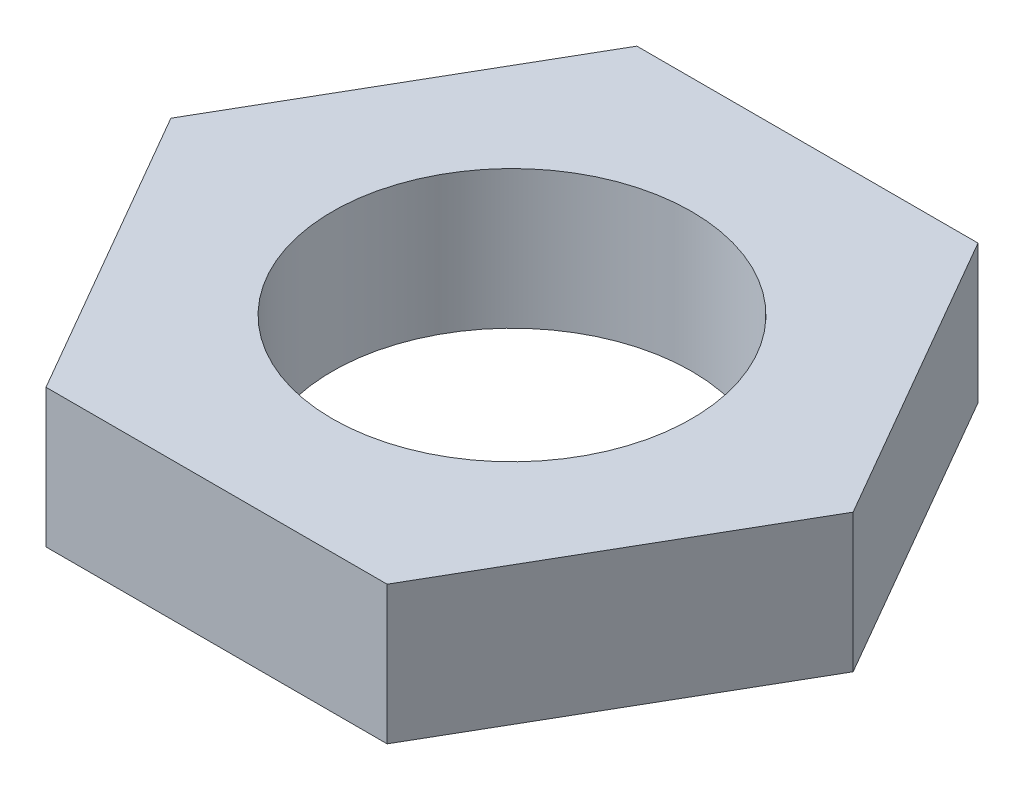
ISO-10303-21;
HEADER;
FILE_DESCRIPTION(('STEP AP214'),'2;1');
FILE_NAME('part.step','',(''),(''),'','','');
FILE_SCHEMA(('AUTOMOTIVE_DESIGN { 1 0 10303 214 1 1 1 1 }'));
ENDSEC;
DATA;
#1=APPLICATION_CONTEXT('core data for automotive mechanical design processes');
#2=APPLICATION_PROTOCOL_DEFINITION('international standard','automotive_design',2000,#1);
#3=PRODUCT_CONTEXT('',#1,'mechanical');
#4=PRODUCT('Part','Part','',(#3));
#5=PRODUCT_RELATED_PRODUCT_CATEGORY('part','',(#4));
#6=PRODUCT_DEFINITION_FORMATION('','',#4);
#7=PRODUCT_DEFINITION_CONTEXT('part definition',#1,'design');
#8=PRODUCT_DEFINITION('design','',#6,#7);
#9=PRODUCT_DEFINITION_SHAPE('','',#8);
#10=(LENGTH_UNIT() NAMED_UNIT(*) SI_UNIT(.MILLI.,.METRE.));
#11=(NAMED_UNIT(*) PLANE_ANGLE_UNIT() SI_UNIT($,.RADIAN.));
#12=(NAMED_UNIT(*) SI_UNIT($,.STERADIAN.) SOLID_ANGLE_UNIT());
#13=UNCERTAINTY_MEASURE_WITH_UNIT(LENGTH_MEASURE(1.E-05),#10,'distance_accuracy_value','');
#14=(GEOMETRIC_REPRESENTATION_CONTEXT(3) GLOBAL_UNCERTAINTY_ASSIGNED_CONTEXT((#13)) GLOBAL_UNIT_ASSIGNED_CONTEXT((#10,
#11,#12)) REPRESENTATION_CONTEXT('',''));
#15=CARTESIAN_POINT('',(0.,0.,0.));
#16=DIRECTION('',(0.,0.,1.));
#17=DIRECTION('',(1.,0.,0.));
#18=AXIS2_PLACEMENT_3D('',#15,#16,#17);
#19=CARTESIAN_POINT('',(0.,2.31,0.));
#20=DIRECTION('',(0.,1.,0.));
#21=DIRECTION('',(0.,0.,1.));
#22=AXIS2_PLACEMENT_3D('',#19,#20,#21);
#23=PLANE('',#22);
#24=DIRECTION('',(0.5,0.,0.866025403784439));
#25=VECTOR('',#24,1.);
#26=CARTESIAN_POINT('',(-5.6984471569016,2.31,0.));
#27=LINE('',#26,#25);
#28=CARTESIAN_POINT('',(-5.6984471569016,2.31,0.));
#29=VERTEX_POINT('',#28);
#30=CARTESIAN_POINT('',(-2.8492235784508,2.31,4.935));
#31=VERTEX_POINT('',#30);
#32=EDGE_CURVE('E135',#29,#31,#27,.T.);
#33=ORIENTED_EDGE('',*,*,#32,.T.);
#34=DIRECTION('',(1.,0.,0.));
#35=VECTOR('',#34,1.);
#36=CARTESIAN_POINT('',(-2.8492235784508,2.31,4.935));
#37=LINE('',#36,#35);
#38=CARTESIAN_POINT('',(2.8492235784508,2.31,4.935));
#39=VERTEX_POINT('',#38);
#40=EDGE_CURVE('E93',#31,#39,#37,.T.);
#41=ORIENTED_EDGE('',*,*,#40,.T.);
#42=DIRECTION('',(0.5,0.,-0.866025403784439));
#43=VECTOR('',#42,1.);
#44=CARTESIAN_POINT('',(2.8492235784508,2.31,4.935));
#45=LINE('',#44,#43);
#46=CARTESIAN_POINT('',(5.6984471569016,2.31,0.));
#47=VERTEX_POINT('',#46);
#48=EDGE_CURVE('E106',#39,#47,#45,.T.);
#49=ORIENTED_EDGE('',*,*,#48,.T.);
#50=DIRECTION('',(-0.5,0.,-0.866025403784438));
#51=VECTOR('',#50,1.);
#52=CARTESIAN_POINT('',(5.6984471569016,2.31,0.));
#53=LINE('',#52,#51);
#54=CARTESIAN_POINT('',(2.8492235784508,2.31,-4.935));
#55=VERTEX_POINT('',#54);
#56=EDGE_CURVE('E100',#47,#55,#53,.T.);
#57=ORIENTED_EDGE('',*,*,#56,.T.);
#58=DIRECTION('',(-1.,0.,0.));
#59=VECTOR('',#58,1.);
#60=CARTESIAN_POINT('',(2.8492235784508,2.31,-4.935));
#61=LINE('',#60,#59);
#62=CARTESIAN_POINT('',(-2.8492235784508,2.31,-4.935));
#63=VERTEX_POINT('',#62);
#64=EDGE_CURVE('E104',#55,#63,#61,.T.);
#65=ORIENTED_EDGE('',*,*,#64,.T.);
#66=DIRECTION('',(-0.5,0.,0.866025403784439));
#67=VECTOR('',#66,1.);
#68=CARTESIAN_POINT('',(-2.8492235784508,2.31,-4.935));
#69=LINE('',#68,#67);
#70=EDGE_CURVE('E56',#63,#29,#69,.T.);
#71=ORIENTED_EDGE('',*,*,#70,.T.);
#72=EDGE_LOOP('',(#33,#41,#49,#57,#65,#71));
#73=FACE_BOUND('',#72,.T.);
#74=CARTESIAN_POINT('',(0.,2.31,0.));
#75=DIRECTION('',(0.,1.,0.));
#76=DIRECTION('',(0.,0.,1.));
#77=AXIS2_PLACEMENT_3D('',#74,#75,#76);
#78=CIRCLE('',#77,3.);
#79=CARTESIAN_POINT('',(0.,2.31,3.));
#80=VERTEX_POINT('',#79);
#81=EDGE_CURVE('E128',#80,#80,#78,.T.);
#82=ORIENTED_EDGE('',*,*,#81,.F.);
#83=EDGE_LOOP('',(#82));
#84=FACE_BOUND('',#83,.T.);
#85=ADVANCED_FACE('F39',(#73,#84),#23,.T.);
#86=CARTESIAN_POINT('',(0.,0.,0.));
#87=DIRECTION('',(0.,1.,0.));
#88=DIRECTION('',(0.,0.,1.));
#89=AXIS2_PLACEMENT_3D('',#86,#87,#88);
#90=PLANE('',#89);
#91=DIRECTION('',(0.5,0.,0.866025403784439));
#92=VECTOR('',#91,1.);
#93=CARTESIAN_POINT('',(-5.6984471569016,0.,0.));
#94=LINE('',#93,#92);
#95=CARTESIAN_POINT('',(-5.6984471569016,0.,0.));
#96=VERTEX_POINT('',#95);
#97=CARTESIAN_POINT('',(-2.8492235784508,0.,4.935));
#98=VERTEX_POINT('',#97);
#99=EDGE_CURVE('E124',#96,#98,#94,.T.);
#100=ORIENTED_EDGE('',*,*,#99,.F.);
#101=DIRECTION('',(-0.5,0.,0.866025403784439));
#102=VECTOR('',#101,1.);
#103=CARTESIAN_POINT('',(-2.8492235784508,0.,-4.935));
#104=LINE('',#103,#102);
#105=CARTESIAN_POINT('',(-2.8492235784508,0.,-4.935));
#106=VERTEX_POINT('',#105);
#107=EDGE_CURVE('E85',#106,#96,#104,.T.);
#108=ORIENTED_EDGE('',*,*,#107,.F.);
#109=DIRECTION('',(-1.,0.,0.));
#110=VECTOR('',#109,1.);
#111=CARTESIAN_POINT('',(2.8492235784508,0.,-4.935));
#112=LINE('',#111,#110);
#113=CARTESIAN_POINT('',(2.8492235784508,0.,-4.935));
#114=VERTEX_POINT('',#113);
#115=EDGE_CURVE('E79',#114,#106,#112,.T.);
#116=ORIENTED_EDGE('',*,*,#115,.F.);
#117=DIRECTION('',(-0.5,0.,-0.866025403784438));
#118=VECTOR('',#117,1.);
#119=CARTESIAN_POINT('',(5.6984471569016,0.,0.));
#120=LINE('',#119,#118);
#121=CARTESIAN_POINT('',(5.6984471569016,0.,0.));
#122=VERTEX_POINT('',#121);
#123=EDGE_CURVE('E114',#122,#114,#120,.T.);
#124=ORIENTED_EDGE('',*,*,#123,.F.);
#125=DIRECTION('',(0.5,0.,-0.866025403784439));
#126=VECTOR('',#125,1.);
#127=CARTESIAN_POINT('',(2.8492235784508,0.,4.935));
#128=LINE('',#127,#126);
#129=CARTESIAN_POINT('',(2.8492235784508,0.,4.935));
#130=VERTEX_POINT('',#129);
#131=EDGE_CURVE('E130',#130,#122,#128,.T.);
#132=ORIENTED_EDGE('',*,*,#131,.F.);
#133=DIRECTION('',(1.,0.,0.));
#134=VECTOR('',#133,1.);
#135=CARTESIAN_POINT('',(-2.8492235784508,0.,4.935));
#136=LINE('',#135,#134);
#137=EDGE_CURVE('E127',#98,#130,#136,.T.);
#138=ORIENTED_EDGE('',*,*,#137,.F.);
#139=EDGE_LOOP('',(#100,#108,#116,#124,#132,#138));
#140=FACE_BOUND('',#139,.T.);
#141=CARTESIAN_POINT('',(0.,0.,0.));
#142=DIRECTION('',(0.,1.,0.));
#143=DIRECTION('',(0.,0.,1.));
#144=AXIS2_PLACEMENT_3D('',#141,#142,#143);
#145=CIRCLE('',#144,3.);
#146=CARTESIAN_POINT('',(0.,0.,3.));
#147=VERTEX_POINT('',#146);
#148=EDGE_CURVE('E228',#147,#147,#145,.T.);
#149=ORIENTED_EDGE('',*,*,#148,.T.);
#150=EDGE_LOOP('',(#149));
#151=FACE_BOUND('',#150,.T.);
#152=ADVANCED_FACE('F144',(#140,#151),#90,.F.);
#153=CARTESIAN_POINT('',(-5.6984471569016,2.31,0.));
#154=DIRECTION('',(0.866025403784439,0.,-0.5));
#155=DIRECTION('',(-0.5,0.,-0.866025403784439));
#156=AXIS2_PLACEMENT_3D('',#153,#154,#155);
#157=PLANE('',#156);
#158=ORIENTED_EDGE('',*,*,#99,.T.);
#159=DIRECTION('',(0.,-1.,0.));
#160=VECTOR('',#159,1.);
#161=CARTESIAN_POINT('',(-2.8492235784508,2.31,4.935));
#162=LINE('',#161,#160);
#163=EDGE_CURVE('E11',#31,#98,#162,.T.);
#164=ORIENTED_EDGE('',*,*,#163,.F.);
#165=ORIENTED_EDGE('',*,*,#32,.F.);
#166=DIRECTION('',(0.,-1.,0.));
#167=VECTOR('',#166,1.);
#168=CARTESIAN_POINT('',(-5.6984471569016,2.31,0.));
#169=LINE('',#168,#167);
#170=EDGE_CURVE('E120',#29,#96,#169,.T.);
#171=ORIENTED_EDGE('',*,*,#170,.T.);
#172=EDGE_LOOP('',(#158,#164,#165,#171));
#173=FACE_BOUND('',#172,.T.);
#174=ADVANCED_FACE('F41',(#173),#157,.F.);
#175=CARTESIAN_POINT('',(-2.8492235784508,2.31,4.935));
#176=DIRECTION('',(0.,0.,-1.));
#177=DIRECTION('',(-1.,0.,0.));
#178=AXIS2_PLACEMENT_3D('',#175,#176,#177);
#179=PLANE('',#178);
#180=ORIENTED_EDGE('',*,*,#137,.T.);
#181=DIRECTION('',(0.,-1.,0.));
#182=VECTOR('',#181,1.);
#183=CARTESIAN_POINT('',(2.8492235784508,2.31,4.935));
#184=LINE('',#183,#182);
#185=EDGE_CURVE('E48',#39,#130,#184,.T.);
#186=ORIENTED_EDGE('',*,*,#185,.F.);
#187=ORIENTED_EDGE('',*,*,#40,.F.);
#188=ORIENTED_EDGE('',*,*,#163,.T.);
#189=EDGE_LOOP('',(#180,#186,#187,#188));
#190=FACE_BOUND('',#189,.T.);
#191=ADVANCED_FACE('F169',(#190),#179,.F.);
#192=CARTESIAN_POINT('',(2.8492235784508,2.31,4.935));
#193=DIRECTION('',(-0.866025403784439,0.,-0.5));
#194=DIRECTION('',(-0.5,0.,0.866025403784439));
#195=AXIS2_PLACEMENT_3D('',#192,#193,#194);
#196=PLANE('',#195);
#197=ORIENTED_EDGE('',*,*,#131,.T.);
#198=DIRECTION('',(0.,-1.,0.));
#199=VECTOR('',#198,1.);
#200=CARTESIAN_POINT('',(5.6984471569016,2.31,0.));
#201=LINE('',#200,#199);
#202=EDGE_CURVE('E115',#47,#122,#201,.T.);
#203=ORIENTED_EDGE('',*,*,#202,.F.);
#204=ORIENTED_EDGE('',*,*,#48,.F.);
#205=ORIENTED_EDGE('',*,*,#185,.T.);
#206=EDGE_LOOP('',(#197,#203,#204,#205));
#207=FACE_BOUND('',#206,.T.);
#208=ADVANCED_FACE('F141',(#207),#196,.F.);
#209=CARTESIAN_POINT('',(5.6984471569016,2.31,0.));
#210=DIRECTION('',(-0.866025403784439,0.,0.5));
#211=DIRECTION('',(0.5,0.,0.866025403784439));
#212=AXIS2_PLACEMENT_3D('',#209,#210,#211);
#213=PLANE('',#212);
#214=ORIENTED_EDGE('',*,*,#123,.T.);
#215=DIRECTION('',(0.,-1.,0.));
#216=VECTOR('',#215,1.);
#217=CARTESIAN_POINT('',(2.8492235784508,2.31,-4.935));
#218=LINE('',#217,#216);
#219=EDGE_CURVE('E111',#55,#114,#218,.T.);
#220=ORIENTED_EDGE('',*,*,#219,.F.);
#221=ORIENTED_EDGE('',*,*,#56,.F.);
#222=ORIENTED_EDGE('',*,*,#202,.T.);
#223=EDGE_LOOP('',(#214,#220,#221,#222));
#224=FACE_BOUND('',#223,.T.);
#225=ADVANCED_FACE('F112',(#224),#213,.F.);
#226=CARTESIAN_POINT('',(2.8492235784508,2.31,-4.935));
#227=DIRECTION('',(0.,0.,1.));
#228=DIRECTION('',(1.,0.,0.));
#229=AXIS2_PLACEMENT_3D('',#226,#227,#228);
#230=PLANE('',#229);
#231=ORIENTED_EDGE('',*,*,#115,.T.);
#232=DIRECTION('',(0.,-1.,0.));
#233=VECTOR('',#232,1.);
#234=CARTESIAN_POINT('',(-2.8492235784508,2.31,-4.935));
#235=LINE('',#234,#233);
#236=EDGE_CURVE('E116',#63,#106,#235,.T.);
#237=ORIENTED_EDGE('',*,*,#236,.F.);
#238=ORIENTED_EDGE('',*,*,#64,.F.);
#239=ORIENTED_EDGE('',*,*,#219,.T.);
#240=EDGE_LOOP('',(#231,#237,#238,#239));
#241=FACE_BOUND('',#240,.T.);
#242=ADVANCED_FACE('F118',(#241),#230,.F.);
#243=CARTESIAN_POINT('',(-2.8492235784508,2.31,-4.935));
#244=DIRECTION('',(0.866025403784439,0.,0.5));
#245=DIRECTION('',(0.5,0.,-0.866025403784439));
#246=AXIS2_PLACEMENT_3D('',#243,#244,#245);
#247=PLANE('',#246);
#248=ORIENTED_EDGE('',*,*,#107,.T.);
#249=ORIENTED_EDGE('',*,*,#170,.F.);
#250=ORIENTED_EDGE('',*,*,#70,.F.);
#251=ORIENTED_EDGE('',*,*,#236,.T.);
#252=EDGE_LOOP('',(#248,#249,#250,#251));
#253=FACE_BOUND('',#252,.T.);
#254=ADVANCED_FACE('F149',(#253),#247,.F.);
#255=CARTESIAN_POINT('',(0.,2.31,0.));
#256=DIRECTION('',(0.,-1.,0.));
#257=DIRECTION('',(0.,0.,-1.));
#258=AXIS2_PLACEMENT_3D('',#255,#256,#257);
#259=CYLINDRICAL_SURFACE('',#258,3.);
#260=ORIENTED_EDGE('',*,*,#81,.T.);
#261=EDGE_LOOP('',(#260));
#262=FACE_BOUND('',#261,.T.);
#263=ORIENTED_EDGE('',*,*,#148,.F.);
#264=EDGE_LOOP('',(#263));
#265=FACE_BOUND('',#264,.T.);
#266=ADVANCED_FACE('F151',(#262,#265),#259,.F.);
#267=CLOSED_SHELL('',(#85,#152,#174,#191,#208,#225,#242,#254,#266));
#268=MANIFOLD_SOLID_BREP('B2',#267);
#269=ADVANCED_BREP_SHAPE_REPRESENTATION('',(#18,#268),#14);
#270=SHAPE_DEFINITION_REPRESENTATION(#9,#269);
ENDSEC;
END-ISO-10303-21;
